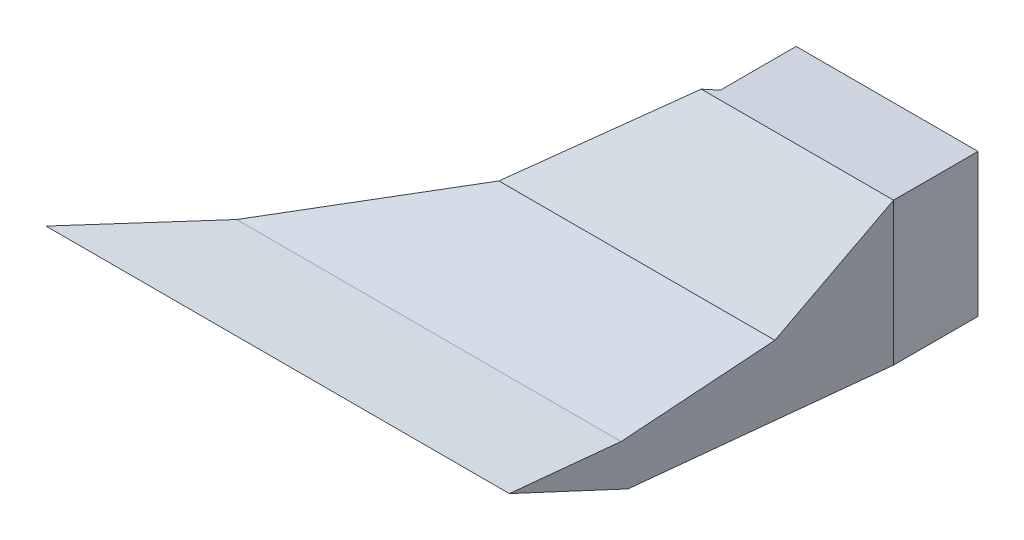
ISO-10303-21;
HEADER;
FILE_DESCRIPTION(('STEP AP214'),'2;1');
FILE_NAME('part.step','',(''),(''),'','','');
FILE_SCHEMA(('AUTOMOTIVE_DESIGN { 1 0 10303 214 1 1 1 1 }'));
ENDSEC;
DATA;
#1=APPLICATION_CONTEXT('core data for automotive mechanical design processes');
#2=APPLICATION_PROTOCOL_DEFINITION('international standard','automotive_design',2000,#1);
#3=PRODUCT_CONTEXT('',#1,'mechanical');
#4=PRODUCT('Part','Part','',(#3));
#5=PRODUCT_RELATED_PRODUCT_CATEGORY('part','',(#4));
#6=PRODUCT_DEFINITION_FORMATION('','',#4);
#7=PRODUCT_DEFINITION_CONTEXT('part definition',#1,'design');
#8=PRODUCT_DEFINITION('design','',#6,#7);
#9=PRODUCT_DEFINITION_SHAPE('','',#8);
#10=(LENGTH_UNIT() NAMED_UNIT(*) SI_UNIT(.MILLI.,.METRE.));
#11=(NAMED_UNIT(*) PLANE_ANGLE_UNIT() SI_UNIT($,.RADIAN.));
#12=(NAMED_UNIT(*) SI_UNIT($,.STERADIAN.) SOLID_ANGLE_UNIT());
#13=UNCERTAINTY_MEASURE_WITH_UNIT(LENGTH_MEASURE(1.E-05),#10,'distance_accuracy_value','');
#14=(GEOMETRIC_REPRESENTATION_CONTEXT(3) GLOBAL_UNCERTAINTY_ASSIGNED_CONTEXT((#13)) GLOBAL_UNIT_ASSIGNED_CONTEXT((#10,
#11,#12)) REPRESENTATION_CONTEXT('',''));
#15=CARTESIAN_POINT('',(0.,0.,0.));
#16=DIRECTION('',(0.,0.,1.));
#17=DIRECTION('',(1.,0.,0.));
#18=AXIS2_PLACEMENT_3D('',#15,#16,#17);
#19=CARTESIAN_POINT('',(50.,12.4,-7.9));
#20=DIRECTION('',(-1.,0.,0.));
#21=DIRECTION('',(0.,0.,1.));
#22=AXIS2_PLACEMENT_3D('',#19,#20,#21);
#23=PLANE('',#22);
#24=DIRECTION('',(0.,-1.,0.));
#25=VECTOR('',#24,1.);
#26=CARTESIAN_POINT('',(50.,12.4,-7.8));
#27=LINE('',#26,#25);
#28=CARTESIAN_POINT('',(50.,12.4,-7.8));
#29=VERTEX_POINT('',#28);
#30=CARTESIAN_POINT('',(50.,0.811035004039767,-7.8));
#31=VERTEX_POINT('',#30);
#32=EDGE_CURVE('E148',#29,#31,#27,.T.);
#33=ORIENTED_EDGE('',*,*,#32,.T.);
#34=DIRECTION('',(0.,0.,1.));
#35=VECTOR('',#34,1.);
#36=CARTESIAN_POINT('',(50.,0.811035004039767,-7.9));
#37=LINE('',#36,#35);
#38=CARTESIAN_POINT('',(50.,0.811035004039767,-7.9));
#39=VERTEX_POINT('',#38);
#40=EDGE_CURVE('E13',#39,#31,#37,.T.);
#41=ORIENTED_EDGE('',*,*,#40,.F.);
#42=DIRECTION('',(0.,-1.,0.));
#43=VECTOR('',#42,1.);
#44=CARTESIAN_POINT('',(50.,12.4,-7.9));
#45=LINE('',#44,#43);
#46=CARTESIAN_POINT('',(50.,12.4,-7.9));
#47=VERTEX_POINT('',#46);
#48=EDGE_CURVE('E136',#47,#39,#45,.T.);
#49=ORIENTED_EDGE('',*,*,#48,.F.);
#50=DIRECTION('',(0.,0.,1.));
#51=VECTOR('',#50,1.);
#52=CARTESIAN_POINT('',(50.,12.4,-7.9));
#53=LINE('',#52,#51);
#54=EDGE_CURVE('E144',#47,#29,#53,.T.);
#55=ORIENTED_EDGE('',*,*,#54,.T.);
#56=EDGE_LOOP('',(#33,#41,#49,#55));
#57=FACE_BOUND('',#56,.T.);
#58=ADVANCED_FACE('F85',(#57),#23,.F.);
#59=CARTESIAN_POINT('',(50.,0.811035004039767,-7.9));
#60=DIRECTION('',(0.,1.,0.));
#61=DIRECTION('',(0.,0.,1.));
#62=AXIS2_PLACEMENT_3D('',#59,#60,#61);
#63=PLANE('',#62);
#64=DIRECTION('',(-1.,0.,0.));
#65=VECTOR('',#64,1.);
#66=CARTESIAN_POINT('',(50.,0.811035004039767,-7.8));
#67=LINE('',#66,#65);
#68=CARTESIAN_POINT('',(34.8,0.811035004039767,-7.8));
#69=VERTEX_POINT('',#68);
#70=EDGE_CURVE('E140',#31,#69,#67,.T.);
#71=ORIENTED_EDGE('',*,*,#70,.T.);
#72=DIRECTION('',(0.,0.,1.));
#73=VECTOR('',#72,1.);
#74=CARTESIAN_POINT('',(34.8,0.811035004039767,-7.9));
#75=LINE('',#74,#73);
#76=CARTESIAN_POINT('',(34.8,0.811035004039767,-7.9));
#77=VERTEX_POINT('',#76);
#78=EDGE_CURVE('E93',#77,#69,#75,.T.);
#79=ORIENTED_EDGE('',*,*,#78,.F.);
#80=DIRECTION('',(-1.,0.,0.));
#81=VECTOR('',#80,1.);
#82=CARTESIAN_POINT('',(50.,0.811035004039767,-7.9));
#83=LINE('',#82,#81);
#84=EDGE_CURVE('E131',#39,#77,#83,.T.);
#85=ORIENTED_EDGE('',*,*,#84,.F.);
#86=ORIENTED_EDGE('',*,*,#40,.T.);
#87=EDGE_LOOP('',(#71,#79,#85,#86));
#88=FACE_BOUND('',#87,.T.);
#89=ADVANCED_FACE('F139',(#88),#63,.F.);
#90=CARTESIAN_POINT('',(34.8,12.4,-7.9));
#91=DIRECTION('',(1.,0.,0.));
#92=DIRECTION('',(0.,0.,-1.));
#93=AXIS2_PLACEMENT_3D('',#90,#91,#92);
#94=PLANE('',#93);
#95=DIRECTION('',(0.,1.,0.));
#96=VECTOR('',#95,1.);
#97=CARTESIAN_POINT('',(34.8,12.4,-7.8));
#98=LINE('',#97,#96);
#99=CARTESIAN_POINT('',(34.8,12.4,-7.8));
#100=VERTEX_POINT('',#99);
#101=EDGE_CURVE('E118',#69,#100,#98,.T.);
#102=ORIENTED_EDGE('',*,*,#101,.T.);
#103=DIRECTION('',(0.,0.,1.));
#104=VECTOR('',#103,1.);
#105=CARTESIAN_POINT('',(34.8,12.4,-7.9));
#106=LINE('',#105,#104);
#107=CARTESIAN_POINT('',(34.8,12.4,-7.9));
#108=VERTEX_POINT('',#107);
#109=EDGE_CURVE('E141',#108,#100,#106,.T.);
#110=ORIENTED_EDGE('',*,*,#109,.F.);
#111=DIRECTION('',(0.,1.,0.));
#112=VECTOR('',#111,1.);
#113=CARTESIAN_POINT('',(34.8,12.4,-7.9));
#114=LINE('',#113,#112);
#115=EDGE_CURVE('E134',#77,#108,#114,.T.);
#116=ORIENTED_EDGE('',*,*,#115,.F.);
#117=ORIENTED_EDGE('',*,*,#78,.T.);
#118=EDGE_LOOP('',(#102,#110,#116,#117));
#119=FACE_BOUND('',#118,.T.);
#120=ADVANCED_FACE('F142',(#119),#94,.F.);
#121=CARTESIAN_POINT('',(50.,12.4,-7.9));
#122=DIRECTION('',(0.,-1.,0.));
#123=DIRECTION('',(1.,0.,0.));
#124=AXIS2_PLACEMENT_3D('',#121,#122,#123);
#125=PLANE('',#124);
#126=DIRECTION('',(1.,0.,0.));
#127=VECTOR('',#126,1.);
#128=CARTESIAN_POINT('',(50.,12.4,-7.8));
#129=LINE('',#128,#127);
#130=EDGE_CURVE('E124',#100,#29,#129,.T.);
#131=ORIENTED_EDGE('',*,*,#130,.T.);
#132=ORIENTED_EDGE('',*,*,#54,.F.);
#133=DIRECTION('',(1.,0.,0.));
#134=VECTOR('',#133,1.);
#135=CARTESIAN_POINT('',(50.,12.4,-7.9));
#136=LINE('',#135,#134);
#137=EDGE_CURVE('E101',#108,#47,#136,.T.);
#138=ORIENTED_EDGE('',*,*,#137,.F.);
#139=ORIENTED_EDGE('',*,*,#109,.T.);
#140=EDGE_LOOP('',(#131,#132,#138,#139));
#141=FACE_BOUND('',#140,.T.);
#142=ADVANCED_FACE('F155',(#141),#125,.F.);
#143=CARTESIAN_POINT('',(0.,0.,-7.9));
#144=DIRECTION('',(0.,0.,-1.));
#145=DIRECTION('',(-1.,0.,0.));
#146=AXIS2_PLACEMENT_3D('',#143,#144,#145);
#147=PLANE('',#146);
#148=ORIENTED_EDGE('',*,*,#48,.T.);
#149=ORIENTED_EDGE('',*,*,#84,.T.);
#150=ORIENTED_EDGE('',*,*,#115,.T.);
#151=ORIENTED_EDGE('',*,*,#137,.T.);
#152=EDGE_LOOP('',(#148,#149,#150,#151));
#153=FACE_BOUND('',#152,.T.);
#154=ADVANCED_FACE('F132',(#153),#147,.T.);
#155=CARTESIAN_POINT('',(0.,0.,-7.8));
#156=DIRECTION('',(0.,0.,-1.));
#157=DIRECTION('',(-1.,0.,0.));
#158=AXIS2_PLACEMENT_3D('',#155,#156,#157);
#159=PLANE('',#158);
#160=ORIENTED_EDGE('',*,*,#32,.F.);
#161=ORIENTED_EDGE('',*,*,#130,.F.);
#162=ORIENTED_EDGE('',*,*,#101,.F.);
#163=ORIENTED_EDGE('',*,*,#70,.F.);
#164=EDGE_LOOP('',(#160,#161,#162,#163));
#165=FACE_BOUND('',#164,.T.);
#166=ADVANCED_FACE('F158',(#165),#159,.F.);
#167=CLOSED_SHELL('',(#58,#89,#120,#142,#154,#166));
#168=MANIFOLD_SOLID_BREP('B2',#167);
#169=CARTESIAN_POINT('',(500000.,-1.05803284932694,25.7915798468931));
#170=DIRECTION('',(0.,0.986393923832144,0.164398987305357));
#171=DIRECTION('',(0.,-0.164398987305357,0.986393923832144));
#172=AXIS2_PLACEMENT_3D('',#169,#170,#171);
#173=PLANE('',#172);
#174=DIRECTION('',(0.764356936022005,0.106003375059563,-0.636020250330942));
#175=VECTOR('',#174,1.);
#176=CARTESIAN_POINT('',(3.29348417834719,-1.05803284933614,25.7915798468867));
#177=LINE('',#176,#175);
#178=CARTESIAN_POINT('',(3.29348417826422,-1.05803284931989,25.7915798469158));
#179=VERTEX_POINT('',#178);
#180=CARTESIAN_POINT('',(11.1178764661304,0.027077981977535,19.2809148590897));
#181=VERTEX_POINT('',#180);
#182=EDGE_CURVE('E234',#179,#181,#177,.T.);
#183=ORIENTED_EDGE('',*,*,#182,.T.);
#184=DIRECTION('',(-1.,0.,0.));
#185=VECTOR('',#184,1.);
#186=CARTESIAN_POINT('',(500000.,0.0270779819721997,19.2809148590982));
#187=LINE('',#186,#185);
#188=CARTESIAN_POINT('',(44.3560571567438,0.0270779819704296,19.2809148590968));
#189=VERTEX_POINT('',#188);
#190=EDGE_CURVE('E449',#189,#181,#187,.T.);
#191=ORIENTED_EDGE('',*,*,#190,.F.);
#192=DIRECTION('',(-0.275900130811343,-0.15801805557006,0.948108333436713));
#193=VECTOR('',#192,1.);
#194=CARTESIAN_POINT('',(42.4614494853536,-1.05803284932549,25.7915798469353));
#195=LINE('',#194,#193);
#196=CARTESIAN_POINT('',(42.4614494852662,-1.05803284932799,25.7915798469086));
#197=VERTEX_POINT('',#196);
#198=EDGE_CURVE('E500',#189,#197,#195,.T.);
#199=ORIENTED_EDGE('',*,*,#198,.T.);
#200=DIRECTION('',(-1.,0.,0.));
#201=VECTOR('',#200,1.);
#202=CARTESIAN_POINT('',(500000.,-1.05803284932694,25.7915798468931));
#203=LINE('',#202,#201);
#204=EDGE_CURVE('E418',#197,#179,#203,.T.);
#205=ORIENTED_EDGE('',*,*,#204,.T.);
#206=EDGE_LOOP('',(#183,#191,#199,#205));
#207=FACE_BOUND('',#206,.T.);
#208=ADVANCED_FACE('F217',(#207),#173,.F.);
#209=CARTESIAN_POINT('',(500000.,0.0270779819721997,19.2809148590982));
#210=DIRECTION('',(0.,0.934304423232793,0.356476148890271));
#211=DIRECTION('',(0.,-0.356476148890271,0.934304423232793));
#212=AXIS2_PLACEMENT_3D('',#209,#210,#211);
#213=PLANE('',#212);
#214=DIRECTION('',(0.746771710863046,0.237085319362907,-0.621387611074817));
#215=VECTOR('',#214,1.);
#216=CARTESIAN_POINT('',(11.1178764661114,0.0270779820112918,19.2809148590727));
#217=LINE('',#216,#215);
#218=CARTESIAN_POINT('',(24.6109965620462,4.31087802502401,8.05331003637828));
#219=VERTEX_POINT('',#218);
#220=EDGE_CURVE('E472',#181,#219,#217,.T.);
#221=ORIENTED_EDGE('',*,*,#220,.T.);
#222=DIRECTION('',(-1.,0.,0.));
#223=VECTOR('',#222,1.);
#224=CARTESIAN_POINT('',(500000.,4.3108780250244,8.05331003636858));
#225=LINE('',#224,#223);
#226=CARTESIAN_POINT('',(47.6232973339066,4.31087802502401,8.05331003636407));
#227=VERTEX_POINT('',#226);
#228=EDGE_CURVE('E437',#227,#219,#225,.T.);
#229=ORIENTED_EDGE('',*,*,#228,.F.);
#230=DIRECTION('',(-0.262359194005389,-0.343988891432191,0.901576006719397));
#231=VECTOR('',#230,1.);
#232=CARTESIAN_POINT('',(44.3560571567166,0.0270779819615541,19.2809148591008));
#233=LINE('',#232,#231);
#234=EDGE_CURVE('E498',#227,#189,#233,.T.);
#235=ORIENTED_EDGE('',*,*,#234,.T.);
#236=ORIENTED_EDGE('',*,*,#190,.T.);
#237=EDGE_LOOP('',(#221,#229,#235,#236));
#238=FACE_BOUND('',#237,.T.);
#239=ADVANCED_FACE('F576',(#238),#213,.F.);
#240=CARTESIAN_POINT('',(500000.,0.811035004039765,0.));
#241=DIRECTION('',(0.,-0.986393923832144,-0.164398987305357));
#242=DIRECTION('',(0.,0.164398987305357,-0.986393923832144));
#243=AXIS2_PLACEMENT_3D('',#240,#241,#242);
#244=PLANE('',#243);
#245=DIRECTION('',(-0.764356936022371,-0.106003375055101,0.636020250331246));
#246=VECTOR('',#245,1.);
#247=CARTESIAN_POINT('',(34.2893100765124,0.811035004043987,-4.19871672002391E-11));
#248=LINE('',#247,#246);
#249=CARTESIAN_POINT('',(34.289310076468,0.811035004039765,0.));
#250=VERTEX_POINT('',#249);
#251=CARTESIAN_POINT('',(11.455474554964,-2.35563166262691,19.));
#252=VERTEX_POINT('',#251);
#253=EDGE_CURVE('E242',#250,#252,#248,.T.);
#254=ORIENTED_EDGE('',*,*,#253,.T.);
#255=DIRECTION('',(-1.,0.,0.));
#256=VECTOR('',#255,1.);
#257=CARTESIAN_POINT('',(500000.,-2.35563166262691,19.));
#258=LINE('',#257,#256);
#259=CARTESIAN_POINT('',(44.4378035601858,-2.35563166262691,19.));
#260=VERTEX_POINT('',#259);
#261=EDGE_CURVE('E425',#260,#252,#258,.T.);
#262=ORIENTED_EDGE('',*,*,#261,.F.);
#263=DIRECTION('',(0.275900130811224,0.158018055572697,-0.948108333436308));
#264=VECTOR('',#263,1.);
#265=CARTESIAN_POINT('',(49.9668157000001,0.811035004039765,0.));
#266=LINE('',#265,#264);
#267=CARTESIAN_POINT('',(49.9668157000476,0.811035004039765,-1.18384163875999E-11));
#268=VERTEX_POINT('',#267);
#269=EDGE_CURVE('E491',#260,#268,#266,.T.);
#270=ORIENTED_EDGE('',*,*,#269,.T.);
#271=DIRECTION('',(-1.,0.,0.));
#272=VECTOR('',#271,1.);
#273=CARTESIAN_POINT('',(500000.,0.811035004039765,0.));
#274=LINE('',#273,#272);
#275=CARTESIAN_POINT('',(34.8000000000184,0.811035004039765,0.));
#276=VERTEX_POINT('',#275);
#277=EDGE_CURVE('E413',#268,#276,#274,.T.);
#278=ORIENTED_EDGE('',*,*,#277,.T.);
#279=EDGE_CURVE('E417',#276,#250,#274,.T.);
#280=ORIENTED_EDGE('',*,*,#279,.T.);
#281=EDGE_LOOP('',(#254,#262,#270,#278,#280));
#282=FACE_BOUND('',#281,.T.);
#283=ADVANCED_FACE('F565',(#282),#244,.F.);
#284=CARTESIAN_POINT('',(500000.,-2.35563166262691,19.));
#285=DIRECTION('',(0.,0.,-1.));
#286=DIRECTION('',(-1.,0.,0.));
#287=AXIS2_PLACEMENT_3D('',#284,#285,#286);
#288=PLANE('',#287);
#289=DIRECTION('',(3.84146596304198E-12,-1.,-3.19979570195479E-12));
#290=VECTOR('',#289,1.);
#291=CARTESIAN_POINT('',(11.4554745549304,-2.35563166262691,19.0000000000025));
#292=LINE('',#291,#290);
#293=CARTESIAN_POINT('',(11.4554745549334,-3.16666666666666,19.));
#294=VERTEX_POINT('',#293);
#295=EDGE_CURVE('E453',#252,#294,#292,.T.);
#296=ORIENTED_EDGE('',*,*,#295,.T.);
#297=DIRECTION('',(-1.,0.,0.));
#298=VECTOR('',#297,1.);
#299=CARTESIAN_POINT('',(0.8,-3.16666666666666,19.));
#300=LINE('',#299,#298);
#301=CARTESIAN_POINT('',(44.4378035601858,-3.16666666666666,19.));
#302=VERTEX_POINT('',#301);
#303=EDGE_CURVE('E591',#302,#294,#300,.T.);
#304=ORIENTED_EDGE('',*,*,#303,.F.);
#305=DIRECTION('',(0.,1.,0.));
#306=VECTOR('',#305,1.);
#307=CARTESIAN_POINT('',(44.437803560201,-2.35563166262691,19.0000000000026));
#308=LINE('',#307,#306);
#309=EDGE_CURVE('E456',#302,#260,#308,.T.);
#310=ORIENTED_EDGE('',*,*,#309,.T.);
#311=ORIENTED_EDGE('',*,*,#261,.T.);
#312=EDGE_LOOP('',(#296,#304,#310,#311));
#313=FACE_BOUND('',#312,.T.);
#314=ADVANCED_FACE('F452',(#313),#288,.F.);
#315=CARTESIAN_POINT('',(500000.,12.0878691271867,0.));
#316=DIRECTION('',(0.,0.719339800338652,0.694658370458996));
#317=DIRECTION('',(0.,-0.694658370458996,0.719339800338652));
#318=AXIS2_PLACEMENT_3D('',#315,#316,#317);
#319=PLANE('',#318);
#320=DIRECTION('',(0.653989150921923,0.52551178467386,-0.544183383286661));
#321=VECTOR('',#320,1.);
#322=CARTESIAN_POINT('',(24.6109965620038,4.31087802505203,8.05331003638562));
#323=LINE('',#322,#321);
#324=CARTESIAN_POINT('',(34.289310076468,12.0878691271867,0.));
#325=VERTEX_POINT('',#324);
#326=EDGE_CURVE('E569',#219,#325,#323,.T.);
#327=ORIENTED_EDGE('',*,*,#326,.T.);
#328=DIRECTION('',(-1.,0.,0.));
#329=VECTOR('',#328,1.);
#330=CARTESIAN_POINT('',(500000.,12.0878691271867,0.));
#331=LINE('',#330,#329);
#332=CARTESIAN_POINT('',(34.8,12.0878691271867,0.));
#333=VERTEX_POINT('',#332);
#334=EDGE_CURVE('E434',#333,#325,#331,.T.);
#335=ORIENTED_EDGE('',*,*,#334,.F.);
#336=DIRECTION('',(0.,0.694658370458996,-0.719339800338652));
#337=VECTOR('',#336,1.);
#338=CARTESIAN_POINT('',(34.8,2.90200435136843,9.51224143374083));
#339=LINE('',#338,#337);
#340=CARTESIAN_POINT('',(34.8,12.4,-0.323220980668115));
#341=VERTEX_POINT('',#340);
#342=EDGE_CURVE('E406',#333,#341,#339,.T.);
#343=ORIENTED_EDGE('',*,*,#342,.T.);
#344=DIRECTION('',(1.,0.,0.));
#345=VECTOR('',#344,1.);
#346=CARTESIAN_POINT('',(50.,12.4,-0.323220980668119));
#347=LINE('',#346,#345);
#348=CARTESIAN_POINT('',(50.,12.4,-0.323220980668119));
#349=VERTEX_POINT('',#348);
#350=EDGE_CURVE('E526',#341,#349,#347,.T.);
#351=ORIENTED_EDGE('',*,*,#350,.T.);
#352=DIRECTION('',(0.,-0.694658370458996,0.719339800338652));
#353=VECTOR('',#352,1.);
#354=CARTESIAN_POINT('',(50.0000000000114,12.0878691271867,0.));
#355=LINE('',#354,#353);
#356=CARTESIAN_POINT('',(50.0000000000114,12.0878691271867,0.));
#357=VERTEX_POINT('',#356);
#358=EDGE_CURVE('E443',#349,#357,#355,.T.);
#359=ORIENTED_EDGE('',*,*,#358,.T.);
#360=DIRECTION('',(1.,0.,0.));
#361=VECTOR('',#360,1.);
#362=CARTESIAN_POINT('',(49.9668157000001,12.0878691271867,0.));
#363=LINE('',#362,#361);
#364=CARTESIAN_POINT('',(49.9668157000208,12.0878691271713,1.4210854715202E-11));
#365=VERTEX_POINT('',#364);
#366=EDGE_CURVE('E506',#365,#357,#363,.T.);
#367=ORIENTED_EDGE('',*,*,#366,.F.);
#368=DIRECTION('',(-0.204887549377446,-0.679921553623818,0.704079379777506));
#369=VECTOR('',#368,1.);
#370=CARTESIAN_POINT('',(47.6232973338593,4.31087802502361,8.05331003637467));
#371=LINE('',#370,#369);
#372=EDGE_CURVE('E496',#365,#227,#371,.T.);
#373=ORIENTED_EDGE('',*,*,#372,.T.);
#374=ORIENTED_EDGE('',*,*,#228,.T.);
#375=EDGE_LOOP('',(#327,#335,#343,#351,#359,#367,#373,#374));
#376=FACE_BOUND('',#375,.T.);
#377=ADVANCED_FACE('F572',(#376),#319,.F.);
#378=CARTESIAN_POINT('',(0.,0.,0.));
#379=DIRECTION('',(0.,0.,1.));
#380=DIRECTION('',(1.,0.,0.));
#381=AXIS2_PLACEMENT_3D('',#378,#379,#380);
#382=PLANE('',#381);
#383=ORIENTED_EDGE('',*,*,#334,.T.);
#384=DIRECTION('',(5.08933543337628E-12,-1.,-4.23649793964402E-12));
#385=VECTOR('',#384,1.);
#386=CARTESIAN_POINT('',(34.289310076455,12.0878691271867,5.78711732816221E-12));
#387=LINE('',#386,#385);
#388=EDGE_CURVE('E467',#325,#250,#387,.T.);
#389=ORIENTED_EDGE('',*,*,#388,.T.);
#390=ORIENTED_EDGE('',*,*,#279,.F.);
#391=DIRECTION('',(0.,1.,0.));
#392=VECTOR('',#391,1.);
#393=CARTESIAN_POINT('',(34.8,0.811035004039765,0.));
#394=LINE('',#393,#392);
#395=EDGE_CURVE('E393',#276,#333,#394,.T.);
#396=ORIENTED_EDGE('',*,*,#395,.T.);
#397=EDGE_LOOP('',(#383,#389,#390,#396));
#398=FACE_BOUND('',#397,.T.);
#399=ADVANCED_FACE('F567',(#398),#382,.T.);
#400=CARTESIAN_POINT('',(0.8,13.2,0.));
#401=DIRECTION('',(0.,0.719339800338653,0.694658370458996));
#402=DIRECTION('',(0.,-0.694658370458996,0.719339800338653));
#403=AXIS2_PLACEMENT_3D('',#400,#401,#402);
#404=PLANE('',#403);
#405=DIRECTION('',(-1.,0.,0.));
#406=VECTOR('',#405,1.);
#407=CARTESIAN_POINT('',(0.8,13.2,0.));
#408=LINE('',#407,#406);
#409=CARTESIAN_POINT('',(50.8,13.2,0.));
#410=VERTEX_POINT('',#409);
#411=CARTESIAN_POINT('',(33.0385753464619,13.2,0.));
#412=VERTEX_POINT('',#411);
#413=EDGE_CURVE('E83',#410,#412,#408,.T.);
#414=ORIENTED_EDGE('',*,*,#413,.T.);
#415=DIRECTION('',(-0.653989150921028,-0.525511784675743,0.544183383285917));
#416=VECTOR('',#415,1.);
#417=CARTESIAN_POINT('',(19.2500783343557,2.12027847461479,11.4733875078943));
#418=LINE('',#417,#416);
#419=CARTESIAN_POINT('',(22.8338355215284,5.,8.4913485730827));
#420=VERTEX_POINT('',#419);
#421=EDGE_CURVE('E488',#412,#420,#418,.T.);
#422=ORIENTED_EDGE('',*,*,#421,.T.);
#423=DIRECTION('',(-1.,0.,0.));
#424=VECTOR('',#423,1.);
#425=CARTESIAN_POINT('',(0.8,5.,8.4913485730827));
#426=LINE('',#425,#424);
#427=CARTESIAN_POINT('',(48.3290121397983,5.,8.4913485730827));
#428=VERTEX_POINT('',#427);
#429=EDGE_CURVE('E226',#428,#420,#426,.T.);
#430=ORIENTED_EDGE('',*,*,#429,.F.);
#431=DIRECTION('',(-0.204887549377384,-0.679921553624057,0.704079379777294));
#432=VECTOR('',#431,1.);
#433=CARTESIAN_POINT('',(48.7010546055065,6.23462695545516,7.21285493448592));
#434=LINE('',#433,#432);
#435=EDGE_CURVE('E517',#410,#428,#434,.T.);
#436=ORIENTED_EDGE('',*,*,#435,.F.);
#437=EDGE_LOOP('',(#414,#422,#430,#436));
#438=FACE_BOUND('',#437,.T.);
#439=ADVANCED_FACE('F610',(#438),#404,.T.);
#440=CARTESIAN_POINT('',(0.8,5.,8.4913485730827));
#441=DIRECTION('',(0.,0.934304423232793,0.356476148890271));
#442=DIRECTION('',(0.,-0.356476148890271,0.934304423232793));
#443=AXIS2_PLACEMENT_3D('',#440,#441,#442);
#444=PLANE('',#443);
#445=ORIENTED_EDGE('',*,*,#429,.T.);
#446=DIRECTION('',(-0.746771710863093,-0.237085319362657,0.621387611074855));
#447=VECTOR('',#446,1.);
#448=CARTESIAN_POINT('',(10.5462707951112,1.09894005761818,18.7158125962999));
#449=LINE('',#448,#447);
#450=CARTESIAN_POINT('',(9.61424653538042,0.803040700347889,19.4913485730827));
#451=VERTEX_POINT('',#450);
#452=EDGE_CURVE('E485',#420,#451,#449,.T.);
#453=ORIENTED_EDGE('',*,*,#452,.T.);
#454=DIRECTION('',(-1.,0.,0.));
#455=VECTOR('',#454,1.);
#456=CARTESIAN_POINT('',(0.8,0.803040700347889,19.4913485730827));
#457=LINE('',#456,#455);
#458=CARTESIAN_POINT('',(45.1280051114941,0.803040700347889,19.4913485730827));
#459=VERTEX_POINT('',#458);
#460=EDGE_CURVE('E583',#459,#451,#457,.T.);
#461=ORIENTED_EDGE('',*,*,#460,.F.);
#462=DIRECTION('',(-0.262359194005471,-0.343988891431397,0.901576006719676));
#463=VECTOR('',#462,1.);
#464=CARTESIAN_POINT('',(45.0574786988718,0.710570899216934,19.7337068472086));
#465=LINE('',#464,#463);
#466=EDGE_CURVE('E515',#428,#459,#465,.T.);
#467=ORIENTED_EDGE('',*,*,#466,.F.);
#468=EDGE_LOOP('',(#445,#453,#461,#467));
#469=FACE_BOUND('',#468,.T.);
#470=ADVANCED_FACE('F607',(#469),#444,.T.);
#471=CARTESIAN_POINT('',(0.8,0.803040700347889,19.4913485730827));
#472=DIRECTION('',(0.,0.986393923832144,0.164398987305357));
#473=DIRECTION('',(0.,-0.164398987305357,0.986393923832144));
#474=AXIS2_PLACEMENT_3D('',#471,#472,#473);
#475=PLANE('',#474);
#476=ORIENTED_EDGE('',*,*,#460,.T.);
#477=DIRECTION('',(-0.764356936022362,-0.106003375055207,0.636020250331239));
#478=VECTOR('',#477,1.);
#479=CARTESIAN_POINT('',(4.46459769213426,0.0888715314594118,23.7763635864135));
#480=LINE('',#479,#478);
#481=CARTESIAN_POINT('',(0.,-0.530292632985445,27.4913485730827));
#482=VERTEX_POINT('',#481);
#483=EDGE_CURVE('E482',#451,#482,#480,.T.);
#484=ORIENTED_EDGE('',*,*,#483,.T.);
#485=DIRECTION('',(-1.,0.,0.));
#486=VECTOR('',#485,1.);
#487=CARTESIAN_POINT('',(0.8,-0.530292632985446,27.4913485730827));
#488=LINE('',#487,#486);
#489=CARTESIAN_POINT('',(42.8,-0.530292632985443,27.4913485730827));
#490=VERTEX_POINT('',#489);
#491=EDGE_CURVE('E586',#490,#482,#488,.T.);
#492=ORIENTED_EDGE('',*,*,#491,.F.);
#493=DIRECTION('',(-0.275900130811223,-0.158018055572718,0.948108333436305));
#494=VECTOR('',#493,1.);
#495=CARTESIAN_POINT('',(41.7537182570544,-1.12953630175566,31.0868105857039));
#496=LINE('',#495,#494);
#497=EDGE_CURVE('E513',#459,#490,#496,.T.);
#498=ORIENTED_EDGE('',*,*,#497,.F.);
#499=EDGE_LOOP('',(#476,#484,#492,#498));
#500=FACE_BOUND('',#499,.T.);
#501=ADVANCED_FACE('F602',(#500),#475,.T.);
#502=CARTESIAN_POINT('',(0.8,-0.530292632985446,27.4913485730827));
#503=DIRECTION('',(0.,-0.955028218655434,0.296514926389597));
#504=DIRECTION('',(0.,-0.296514926389597,-0.955028218655434));
#505=AXIS2_PLACEMENT_3D('',#502,#503,#504);
#506=PLANE('',#505);
#507=ORIENTED_EDGE('',*,*,#491,.T.);
#508=DIRECTION('',(0.753964395696606,-0.19478518700477,-0.627372633245481));
#509=VECTOR('',#508,1.);
#510=CARTESIAN_POINT('',(0.454769847982516,-0.647781509634009,27.1129352704415));
#511=LINE('',#510,#509);
#512=CARTESIAN_POINT('',(10.2047398249335,-3.16666666666666,18.9999999999999));
#513=VERTEX_POINT('',#512);
#514=EDGE_CURVE('E480',#482,#513,#511,.T.);
#515=ORIENTED_EDGE('',*,*,#514,.T.);
#516=DIRECTION('',(-1.,0.,0.));
#517=VECTOR('',#516,1.);
#518=CARTESIAN_POINT('',(11.4554745549335,-3.16666666666667,18.9999999999999));
#519=LINE('',#518,#517);
#520=EDGE_CURVE('E474',#294,#513,#519,.T.);
#521=ORIENTED_EDGE('',*,*,#520,.F.);
#522=DIRECTION('',(-0.753964395696704,0.194785187004126,0.627372633245563));
#523=VECTOR('',#522,1.);
#524=CARTESIAN_POINT('',(11.4554745549335,-3.16666666666667,18.9999999999999));
#525=LINE('',#524,#523);
#526=EDGE_CURVE('E464',#294,#179,#525,.T.);
#527=ORIENTED_EDGE('',*,*,#526,.T.);
#528=ORIENTED_EDGE('',*,*,#204,.F.);
#529=DIRECTION('',(0.267765548515724,-0.285687416999285,-0.920154503763553));
#530=VECTOR('',#529,1.);
#531=CARTESIAN_POINT('',(44.437803560201,-3.16666666666667,19.0000000000026));
#532=LINE('',#531,#530);
#533=EDGE_CURVE('E502',#197,#302,#532,.T.);
#534=ORIENTED_EDGE('',*,*,#533,.T.);
#535=CARTESIAN_POINT('',(45.270987860201,-3.16666666666667,19.0000000000026));
#536=VERTEX_POINT('',#535);
#537=EDGE_CURVE('E589',#536,#302,#300,.T.);
#538=ORIENTED_EDGE('',*,*,#537,.F.);
#539=DIRECTION('',(0.267765548515611,-0.285687417000638,-0.920154503763166));
#540=VECTOR('',#539,1.);
#541=CARTESIAN_POINT('',(39.7886676631817,2.68259177953627,37.8395469406913));
#542=LINE('',#541,#540);
#543=EDGE_CURVE('E511',#490,#536,#542,.T.);
#544=ORIENTED_EDGE('',*,*,#543,.F.);
#545=EDGE_LOOP('',(#507,#515,#521,#527,#528,#534,#538,#544));
#546=FACE_BOUND('',#545,.T.);
#547=ADVANCED_FACE('F597',(#546),#506,.T.);
#548=CARTESIAN_POINT('',(0.8,-1.,6.));
#549=DIRECTION('',(0.,-0.986393923832144,-0.164398987305357));
#550=DIRECTION('',(0.,0.164398987305357,-0.986393923832144));
#551=AXIS2_PLACEMENT_3D('',#548,#549,#550);
#552=PLANE('',#551);
#553=ORIENTED_EDGE('',*,*,#303,.T.);
#554=ORIENTED_EDGE('',*,*,#520,.T.);
#555=DIRECTION('',(0.764356936022362,0.106003375055206,-0.636020250331239));
#556=VECTOR('',#555,1.);
#557=CARTESIAN_POINT('',(11.2055575476944,-3.02787018111397,18.1672210866838));
#558=LINE('',#557,#556);
#559=CARTESIAN_POINT('',(33.0385753464619,0.,0.));
#560=VERTEX_POINT('',#559);
#561=EDGE_CURVE('E389',#513,#560,#558,.T.);
#562=ORIENTED_EDGE('',*,*,#561,.T.);
#563=DIRECTION('',(-1.,0.,0.));
#564=VECTOR('',#563,1.);
#565=CARTESIAN_POINT('',(0.8,0.,0.));
#566=LINE('',#565,#564);
#567=CARTESIAN_POINT('',(50.8,0.,0.));
#568=VERTEX_POINT('',#567);
#569=EDGE_CURVE('E388',#568,#560,#566,.T.);
#570=ORIENTED_EDGE('',*,*,#569,.F.);
#571=DIRECTION('',(0.275900130811223,0.158018055572717,-0.948108333436305));
#572=VECTOR('',#571,1.);
#573=CARTESIAN_POINT('',(45.3808594094048,-3.10373922797074,18.6224353678245));
#574=LINE('',#573,#572);
#575=EDGE_CURVE('E508',#536,#568,#574,.T.);
#576=ORIENTED_EDGE('',*,*,#575,.F.);
#577=ORIENTED_EDGE('',*,*,#537,.T.);
#578=EDGE_LOOP('',(#553,#554,#562,#570,#576,#577));
#579=FACE_BOUND('',#578,.T.);
#580=ADVANCED_FACE('F219',(#579),#552,.T.);
#581=CARTESIAN_POINT('',(0.,13.2,-0.8));
#582=DIRECTION('',(0.,-1.,0.));
#583=DIRECTION('',(1.,0.,0.));
#584=AXIS2_PLACEMENT_3D('',#581,#582,#583);
#585=PLANE('',#584);
#586=DIRECTION('',(-0.76868790047924,0.,0.639624039304979));
#587=VECTOR('',#586,1.);
#588=CARTESIAN_POINT('',(34.,13.2,-0.800000000000006));
#589=LINE('',#588,#587);
#590=CARTESIAN_POINT('',(34.,13.2,-0.8));
#591=VERTEX_POINT('',#590);
#592=EDGE_CURVE('E371',#591,#412,#589,.T.);
#593=ORIENTED_EDGE('',*,*,#592,.T.);
#594=ORIENTED_EDGE('',*,*,#413,.F.);
#595=DIRECTION('',(0.,0.,1.));
#596=VECTOR('',#595,1.);
#597=CARTESIAN_POINT('',(50.8,13.2,-0.8));
#598=LINE('',#597,#596);
#599=CARTESIAN_POINT('',(50.8,13.2,-7.8));
#600=VERTEX_POINT('',#599);
#601=EDGE_CURVE('E423',#600,#410,#598,.T.);
#602=ORIENTED_EDGE('',*,*,#601,.F.);
#603=DIRECTION('',(1.,0.,0.));
#604=VECTOR('',#603,1.);
#605=CARTESIAN_POINT('',(50.8,13.2,-7.8));
#606=LINE('',#605,#604);
#607=CARTESIAN_POINT('',(34.,13.2,-7.8));
#608=VERTEX_POINT('',#607);
#609=EDGE_CURVE('E399',#608,#600,#606,.T.);
#610=ORIENTED_EDGE('',*,*,#609,.F.);
#611=DIRECTION('',(0.,0.,1.));
#612=VECTOR('',#611,1.);
#613=CARTESIAN_POINT('',(34.,13.2,-7.8));
#614=LINE('',#613,#612);
#615=EDGE_CURVE('E394',#608,#591,#614,.T.);
#616=ORIENTED_EDGE('',*,*,#615,.T.);
#617=EDGE_LOOP('',(#593,#594,#602,#610,#616));
#618=FACE_BOUND('',#617,.T.);
#619=ADVANCED_FACE('F614',(#618),#585,.F.);
#620=CARTESIAN_POINT('',(0.,0.,-0.8));
#621=DIRECTION('',(0.,1.,0.));
#622=DIRECTION('',(0.,0.,1.));
#623=AXIS2_PLACEMENT_3D('',#620,#621,#622);
#624=PLANE('',#623);
#625=DIRECTION('',(-0.76868790047924,0.,0.639624039304979));
#626=VECTOR('',#625,1.);
#627=CARTESIAN_POINT('',(13.9100429963318,0.,15.9168228355594));
#628=LINE('',#627,#626);
#629=CARTESIAN_POINT('',(34.,0.,-0.800000000000022));
#630=VERTEX_POINT('',#629);
#631=EDGE_CURVE('E368',#630,#560,#628,.T.);
#632=ORIENTED_EDGE('',*,*,#631,.F.);
#633=DIRECTION('',(0.,0.,1.));
#634=VECTOR('',#633,1.);
#635=CARTESIAN_POINT('',(34.,0.,-7.8));
#636=LINE('',#635,#634);
#637=CARTESIAN_POINT('',(34.,0.,-7.8));
#638=VERTEX_POINT('',#637);
#639=EDGE_CURVE('E384',#638,#630,#636,.T.);
#640=ORIENTED_EDGE('',*,*,#639,.F.);
#641=DIRECTION('',(-1.,0.,0.));
#642=VECTOR('',#641,1.);
#643=CARTESIAN_POINT('',(50.8,0.,-7.8));
#644=LINE('',#643,#642);
#645=CARTESIAN_POINT('',(50.8,0.,-7.8));
#646=VERTEX_POINT('',#645);
#647=EDGE_CURVE('E542',#646,#638,#644,.T.);
#648=ORIENTED_EDGE('',*,*,#647,.F.);
#649=DIRECTION('',(0.,0.,1.));
#650=VECTOR('',#649,1.);
#651=CARTESIAN_POINT('',(50.8,0.,-0.8));
#652=LINE('',#651,#650);
#653=EDGE_CURVE('E559',#646,#568,#652,.T.);
#654=ORIENTED_EDGE('',*,*,#653,.T.);
#655=ORIENTED_EDGE('',*,*,#569,.T.);
#656=EDGE_LOOP('',(#632,#640,#648,#654,#655));
#657=FACE_BOUND('',#656,.T.);
#658=ADVANCED_FACE('F382',(#657),#624,.F.);
#659=CARTESIAN_POINT('',(50.,0.,0.));
#660=DIRECTION('',(-1.,0.,0.));
#661=DIRECTION('',(0.,0.,1.));
#662=AXIS2_PLACEMENT_3D('',#659,#660,#661);
#663=PLANE('',#662);
#664=DIRECTION('',(0.,-1.,0.));
#665=VECTOR('',#664,1.);
#666=CARTESIAN_POINT('',(50.,0.,0.));
#667=LINE('',#666,#665);
#668=CARTESIAN_POINT('',(50.,0.811035004039765,0.));
#669=VERTEX_POINT('',#668);
#670=EDGE_CURVE('E521',#357,#669,#667,.T.);
#671=ORIENTED_EDGE('',*,*,#670,.F.);
#672=ORIENTED_EDGE('',*,*,#358,.F.);
#673=DIRECTION('',(0.,0.,-1.));
#674=VECTOR('',#673,1.);
#675=CARTESIAN_POINT('',(50.,12.4,18.3829279346442));
#676=LINE('',#675,#674);
#677=CARTESIAN_POINT('',(50.,12.4,-7.8));
#678=VERTEX_POINT('',#677);
#679=EDGE_CURVE('E528',#349,#678,#676,.T.);
#680=ORIENTED_EDGE('',*,*,#679,.T.);
#681=DIRECTION('',(0.,-1.,0.));
#682=VECTOR('',#681,1.);
#683=CARTESIAN_POINT('',(50.,12.0878691271867,-7.8));
#684=LINE('',#683,#682);
#685=CARTESIAN_POINT('',(50.,0.811035004039765,-7.8));
#686=VERTEX_POINT('',#685);
#687=EDGE_CURVE('E535',#678,#686,#684,.T.);
#688=ORIENTED_EDGE('',*,*,#687,.T.);
#689=DIRECTION('',(0.,0.,1.));
#690=VECTOR('',#689,1.);
#691=CARTESIAN_POINT('',(50.,0.811035004039765,-0.8));
#692=LINE('',#691,#690);
#693=EDGE_CURVE('E549',#686,#669,#692,.T.);
#694=ORIENTED_EDGE('',*,*,#693,.T.);
#695=EDGE_LOOP('',(#671,#672,#680,#688,#694));
#696=FACE_BOUND('',#695,.T.);
#697=ADVANCED_FACE('F629',(#696),#663,.T.);
#698=CARTESIAN_POINT('',(50.8,0.,0.));
#699=DIRECTION('',(-1.,0.,0.));
#700=DIRECTION('',(0.,0.,1.));
#701=AXIS2_PLACEMENT_3D('',#698,#699,#700);
#702=PLANE('',#701);
#703=ORIENTED_EDGE('',*,*,#601,.T.);
#704=DIRECTION('',(0.,1.,0.));
#705=VECTOR('',#704,1.);
#706=CARTESIAN_POINT('',(50.8,0.811035004039765,0.));
#707=LINE('',#706,#705);
#708=EDGE_CURVE('E519',#568,#410,#707,.T.);
#709=ORIENTED_EDGE('',*,*,#708,.F.);
#710=ORIENTED_EDGE('',*,*,#653,.F.);
#711=DIRECTION('',(0.,-1.,0.));
#712=VECTOR('',#711,1.);
#713=CARTESIAN_POINT('',(50.8,13.2,-7.8));
#714=LINE('',#713,#712);
#715=EDGE_CURVE('E376',#600,#646,#714,.T.);
#716=ORIENTED_EDGE('',*,*,#715,.F.);
#717=EDGE_LOOP('',(#703,#709,#710,#716));
#718=FACE_BOUND('',#717,.T.);
#719=ADVANCED_FACE('F618',(#718),#702,.F.);
#720=CARTESIAN_POINT('',(50.,0.811035004039765,-0.8));
#721=DIRECTION('',(0.,1.,0.));
#722=DIRECTION('',(0.,0.,1.));
#723=AXIS2_PLACEMENT_3D('',#720,#721,#722);
#724=PLANE('',#723);
#725=EDGE_CURVE('E416',#669,#268,#274,.T.);
#726=ORIENTED_EDGE('',*,*,#725,.F.);
#727=ORIENTED_EDGE('',*,*,#693,.F.);
#728=DIRECTION('',(-1.,0.,0.));
#729=VECTOR('',#728,1.);
#730=CARTESIAN_POINT('',(34.8,0.811035004039767,-7.8));
#731=LINE('',#730,#729);
#732=CARTESIAN_POINT('',(34.8,0.811035004039767,-7.8));
#733=VERTEX_POINT('',#732);
#734=EDGE_CURVE('E377',#686,#733,#731,.T.);
#735=ORIENTED_EDGE('',*,*,#734,.T.);
#736=DIRECTION('',(0.,0.,1.));
#737=VECTOR('',#736,1.);
#738=CARTESIAN_POINT('',(34.8,0.811035004039765,-0.8));
#739=LINE('',#738,#737);
#740=EDGE_CURVE('E397',#733,#276,#739,.T.);
#741=ORIENTED_EDGE('',*,*,#740,.T.);
#742=ORIENTED_EDGE('',*,*,#277,.F.);
#743=EDGE_LOOP('',(#726,#727,#735,#741,#742));
#744=FACE_BOUND('',#743,.T.);
#745=ADVANCED_FACE('F626',(#744),#724,.T.);
#746=CARTESIAN_POINT('',(34.8,0.811035004039765,-0.8));
#747=DIRECTION('',(1.,0.,0.));
#748=DIRECTION('',(0.,0.,-1.));
#749=AXIS2_PLACEMENT_3D('',#746,#747,#748);
#750=PLANE('',#749);
#751=ORIENTED_EDGE('',*,*,#395,.F.);
#752=ORIENTED_EDGE('',*,*,#740,.F.);
#753=DIRECTION('',(0.,1.,0.));
#754=VECTOR('',#753,1.);
#755=CARTESIAN_POINT('',(34.8,12.0878691271867,-7.8));
#756=LINE('',#755,#754);
#757=CARTESIAN_POINT('',(34.8,12.4,-7.8));
#758=VERTEX_POINT('',#757);
#759=EDGE_CURVE('E531',#733,#758,#756,.T.);
#760=ORIENTED_EDGE('',*,*,#759,.T.);
#761=DIRECTION('',(0.,0.,-1.));
#762=VECTOR('',#761,1.);
#763=CARTESIAN_POINT('',(34.8,12.4,18.3829279346442));
#764=LINE('',#763,#762);
#765=EDGE_CURVE('E409',#341,#758,#764,.T.);
#766=ORIENTED_EDGE('',*,*,#765,.F.);
#767=ORIENTED_EDGE('',*,*,#342,.F.);
#768=EDGE_LOOP('',(#751,#752,#760,#766,#767));
#769=FACE_BOUND('',#768,.T.);
#770=ADVANCED_FACE('F636',(#769),#750,.T.);
#771=CARTESIAN_POINT('',(0.,0.,-7.8));
#772=DIRECTION('',(0.,0.,-1.));
#773=DIRECTION('',(-1.,0.,0.));
#774=AXIS2_PLACEMENT_3D('',#771,#772,#773);
#775=PLANE('',#774);
#776=DIRECTION('',(1.,0.,0.));
#777=VECTOR('',#776,1.);
#778=CARTESIAN_POINT('',(50.,12.4,-7.8));
#779=LINE('',#778,#777);
#780=EDGE_CURVE('E410',#758,#678,#779,.T.);
#781=ORIENTED_EDGE('',*,*,#780,.F.);
#782=ORIENTED_EDGE('',*,*,#759,.F.);
#783=ORIENTED_EDGE('',*,*,#734,.F.);
#784=ORIENTED_EDGE('',*,*,#687,.F.);
#785=EDGE_LOOP('',(#781,#782,#783,#784));
#786=FACE_BOUND('',#785,.T.);
#787=ORIENTED_EDGE('',*,*,#715,.T.);
#788=ORIENTED_EDGE('',*,*,#647,.T.);
#789=DIRECTION('',(0.,1.,0.));
#790=VECTOR('',#789,1.);
#791=CARTESIAN_POINT('',(34.,13.2,-7.8));
#792=LINE('',#791,#790);
#793=EDGE_CURVE('E392',#638,#608,#792,.T.);
#794=ORIENTED_EDGE('',*,*,#793,.T.);
#795=ORIENTED_EDGE('',*,*,#609,.T.);
#796=EDGE_LOOP('',(#787,#788,#794,#795));
#797=FACE_BOUND('',#796,.T.);
#798=ADVANCED_FACE('F617',(#786,#797),#775,.T.);
#799=CARTESIAN_POINT('',(34.,13.2,-7.8));
#800=DIRECTION('',(1.,0.,0.));
#801=DIRECTION('',(0.,0.,-1.));
#802=AXIS2_PLACEMENT_3D('',#799,#800,#801);
#803=PLANE('',#802);
#804=DIRECTION('',(0.,1.,0.));
#805=VECTOR('',#804,1.);
#806=CARTESIAN_POINT('',(34.,13.2,-0.8));
#807=LINE('',#806,#805);
#808=EDGE_CURVE('E364',#630,#591,#807,.T.);
#809=ORIENTED_EDGE('',*,*,#808,.T.);
#810=ORIENTED_EDGE('',*,*,#615,.F.);
#811=ORIENTED_EDGE('',*,*,#793,.F.);
#812=ORIENTED_EDGE('',*,*,#639,.T.);
#813=EDGE_LOOP('',(#809,#810,#811,#812));
#814=FACE_BOUND('',#813,.T.);
#815=ADVANCED_FACE('F391',(#814),#803,.F.);
#816=CARTESIAN_POINT('',(50.,12.4,18.3829279346442));
#817=DIRECTION('',(0.,1.,0.));
#818=DIRECTION('',(0.,0.,1.));
#819=AXIS2_PLACEMENT_3D('',#816,#817,#818);
#820=PLANE('',#819);
#821=ORIENTED_EDGE('',*,*,#765,.T.);
#822=ORIENTED_EDGE('',*,*,#780,.T.);
#823=ORIENTED_EDGE('',*,*,#679,.F.);
#824=ORIENTED_EDGE('',*,*,#350,.F.);
#825=EDGE_LOOP('',(#821,#822,#823,#824));
#826=FACE_BOUND('',#825,.T.);
#827=ADVANCED_FACE('F632',(#826),#820,.F.);
#828=CARTESIAN_POINT('',(46.8340300827827,0.,13.6287326780728));
#829=DIRECTION('',(-0.960171716954331,0.,-0.279410583122708));
#830=DIRECTION('',(-0.279410583122708,0.,0.960171716954331));
#831=AXIS2_PLACEMENT_3D('',#828,#829,#830);
#832=PLANE('',#831);
#833=ORIENTED_EDGE('',*,*,#575,.T.);
#834=ORIENTED_EDGE('',*,*,#708,.T.);
#835=ORIENTED_EDGE('',*,*,#435,.T.);
#836=ORIENTED_EDGE('',*,*,#466,.T.);
#837=ORIENTED_EDGE('',*,*,#497,.T.);
#838=ORIENTED_EDGE('',*,*,#543,.T.);
#839=EDGE_LOOP('',(#833,#834,#835,#836,#837,#838));
#840=FACE_BOUND('',#839,.T.);
#841=ADVANCED_FACE('F620',(#840),#832,.F.);
#842=CARTESIAN_POINT('',(49.9668157000001,12.0878691271867,0.));
#843=DIRECTION('',(0.,0.,-1.));
#844=DIRECTION('',(0.,1.,0.));
#845=AXIS2_PLACEMENT_3D('',#842,#843,#844);
#846=PLANE('',#845);
#847=ORIENTED_EDGE('',*,*,#366,.T.);
#848=ORIENTED_EDGE('',*,*,#670,.T.);
#849=ORIENTED_EDGE('',*,*,#725,.T.);
#850=DIRECTION('',(0.,1.,0.));
#851=VECTOR('',#850,1.);
#852=CARTESIAN_POINT('',(49.9668157000001,12.0878691271867,0.));
#853=LINE('',#852,#851);
#854=EDGE_CURVE('E493',#268,#365,#853,.T.);
#855=ORIENTED_EDGE('',*,*,#854,.T.);
#856=EDGE_LOOP('',(#847,#848,#849,#855));
#857=FACE_BOUND('',#856,.T.);
#858=ADVANCED_FACE('F628',(#857),#846,.T.);
#859=CARTESIAN_POINT('',(46.0008457827827,0.,13.6287326780728));
#860=DIRECTION('',(0.960171716954331,0.,0.279410583122708));
#861=DIRECTION('',(0.279410583122708,0.,-0.960171716954331));
#862=AXIS2_PLACEMENT_3D('',#859,#860,#861);
#863=PLANE('',#862);
#864=ORIENTED_EDGE('',*,*,#269,.F.);
#865=ORIENTED_EDGE('',*,*,#309,.F.);
#866=ORIENTED_EDGE('',*,*,#533,.F.);
#867=ORIENTED_EDGE('',*,*,#198,.F.);
#868=ORIENTED_EDGE('',*,*,#234,.F.);
#869=ORIENTED_EDGE('',*,*,#372,.F.);
#870=ORIENTED_EDGE('',*,*,#854,.F.);
#871=EDGE_LOOP('',(#864,#865,#866,#867,#868,#869,#870));
#872=FACE_BOUND('',#871,.T.);
#873=ADVANCED_FACE('F623',(#872),#863,.F.);
#874=CARTESIAN_POINT('',(13.5167059884363,0.,16.2441179648849));
#875=DIRECTION('',(-0.639624039304979,0.,-0.76868790047924));
#876=DIRECTION('',(-0.76868790047924,0.,0.639624039304979));
#877=AXIS2_PLACEMENT_3D('',#874,#875,#876);
#878=PLANE('',#877);
#879=ORIENTED_EDGE('',*,*,#561,.F.);
#880=ORIENTED_EDGE('',*,*,#514,.F.);
#881=ORIENTED_EDGE('',*,*,#483,.F.);
#882=ORIENTED_EDGE('',*,*,#452,.F.);
#883=ORIENTED_EDGE('',*,*,#421,.F.);
#884=ORIENTED_EDGE('',*,*,#592,.F.);
#885=ORIENTED_EDGE('',*,*,#808,.F.);
#886=ORIENTED_EDGE('',*,*,#631,.T.);
#887=EDGE_LOOP('',(#879,#880,#881,#882,#883,#884,#885,#886));
#888=FACE_BOUND('',#887,.T.);
#889=ADVANCED_FACE('F367',(#888),#878,.T.);
#890=CARTESIAN_POINT('',(14.7674407184363,0.,16.2441179648849));
#891=DIRECTION('',(-0.639624039304979,0.,-0.76868790047924));
#892=DIRECTION('',(-0.76868790047924,0.,0.639624039304979));
#893=AXIS2_PLACEMENT_3D('',#890,#891,#892);
#894=PLANE('',#893);
#895=ORIENTED_EDGE('',*,*,#326,.F.);
#896=ORIENTED_EDGE('',*,*,#220,.F.);
#897=ORIENTED_EDGE('',*,*,#182,.F.);
#898=ORIENTED_EDGE('',*,*,#526,.F.);
#899=ORIENTED_EDGE('',*,*,#295,.F.);
#900=ORIENTED_EDGE('',*,*,#253,.F.);
#901=ORIENTED_EDGE('',*,*,#388,.F.);
#902=EDGE_LOOP('',(#895,#896,#897,#898,#899,#900,#901));
#903=FACE_BOUND('',#902,.T.);
#904=ADVANCED_FACE('F461',(#903),#894,.F.);
#905=CLOSED_SHELL('',(#208,#239,#283,#314,#377,#399,#439,#470,#501,#547,#580,#619,#658,#697,
#719,#745,#770,#798,#815,#827,#841,#858,#873,#889,#904));
#906=MANIFOLD_SOLID_BREP('B7',#905);
#907=ADVANCED_BREP_SHAPE_REPRESENTATION('',(#18,#168,#906),#14);
#908=SHAPE_DEFINITION_REPRESENTATION(#9,#907);
ENDSEC;
END-ISO-10303-21;
